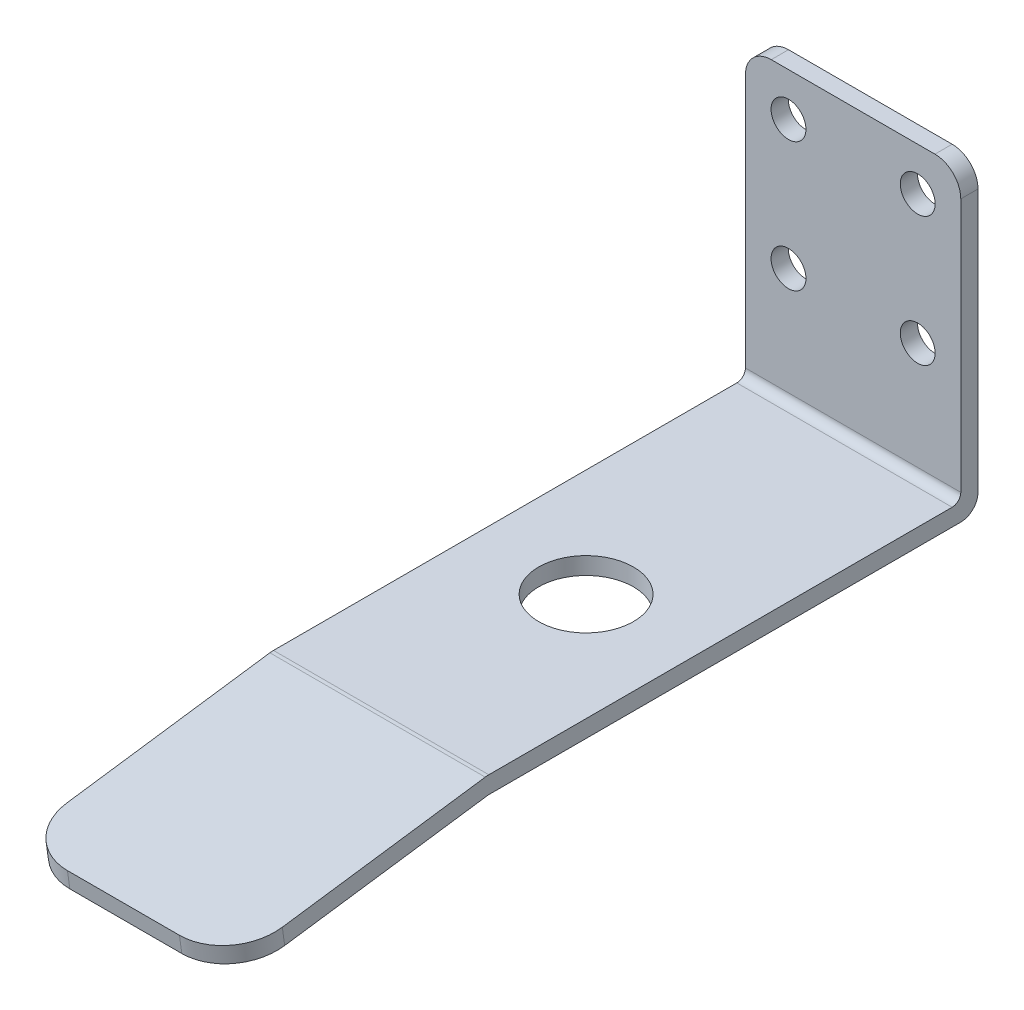
ISO-10303-21;
HEADER;
FILE_DESCRIPTION(('STEP AP214'),'2;1');
FILE_NAME('part.step','',(''),(''),'','','');
FILE_SCHEMA(('AUTOMOTIVE_DESIGN { 1 0 10303 214 1 1 1 1 }'));
ENDSEC;
DATA;
#1=APPLICATION_CONTEXT('core data for automotive mechanical design processes');
#2=APPLICATION_PROTOCOL_DEFINITION('international standard','automotive_design',2000,#1);
#3=PRODUCT_CONTEXT('',#1,'mechanical');
#4=PRODUCT('Part','Part','',(#3));
#5=PRODUCT_RELATED_PRODUCT_CATEGORY('part','',(#4));
#6=PRODUCT_DEFINITION_FORMATION('','',#4);
#7=PRODUCT_DEFINITION_CONTEXT('part definition',#1,'design');
#8=PRODUCT_DEFINITION('design','',#6,#7);
#9=PRODUCT_DEFINITION_SHAPE('','',#8);
#10=(LENGTH_UNIT() NAMED_UNIT(*) SI_UNIT(.MILLI.,.METRE.));
#11=(NAMED_UNIT(*) PLANE_ANGLE_UNIT() SI_UNIT($,.RADIAN.));
#12=(NAMED_UNIT(*) SI_UNIT($,.STERADIAN.) SOLID_ANGLE_UNIT());
#13=UNCERTAINTY_MEASURE_WITH_UNIT(LENGTH_MEASURE(1.E-05),#10,'distance_accuracy_value','');
#14=(GEOMETRIC_REPRESENTATION_CONTEXT(3) GLOBAL_UNCERTAINTY_ASSIGNED_CONTEXT((#13)) GLOBAL_UNIT_ASSIGNED_CONTEXT((#10,
#11,#12)) REPRESENTATION_CONTEXT('',''));
#15=CARTESIAN_POINT('',(0.,0.,0.));
#16=DIRECTION('',(0.,0.,1.));
#17=DIRECTION('',(1.,0.,0.));
#18=AXIS2_PLACEMENT_3D('',#15,#16,#17);
#19=CARTESIAN_POINT('',(0.,0.,2.));
#20=DIRECTION('',(0.,0.,1.));
#21=DIRECTION('',(1.,0.,0.));
#22=AXIS2_PLACEMENT_3D('',#19,#20,#21);
#23=PLANE('',#22);
#24=DIRECTION('',(0.,-1.,0.));
#25=VECTOR('',#24,1.);
#26=CARTESIAN_POINT('',(-12.5,12.5,2.));
#27=LINE('',#26,#25);
#28=CARTESIAN_POINT('',(-12.5,9.5,2.));
#29=VERTEX_POINT('',#28);
#30=CARTESIAN_POINT('',(-12.5,-20.,2.));
#31=VERTEX_POINT('',#30);
#32=EDGE_CURVE('E198',#29,#31,#27,.T.);
#33=ORIENTED_EDGE('',*,*,#32,.T.);
#34=DIRECTION('',(-1.,0.,0.));
#35=VECTOR('',#34,1.);
#36=CARTESIAN_POINT('',(0.,-20.,2.));
#37=LINE('',#36,#35);
#38=CARTESIAN_POINT('',(12.5,-20.,2.));
#39=VERTEX_POINT('',#38);
#40=EDGE_CURVE('E232',#31,#39,#37,.F.);
#41=ORIENTED_EDGE('',*,*,#40,.T.);
#42=DIRECTION('',(0.,1.,0.));
#43=VECTOR('',#42,1.);
#44=CARTESIAN_POINT('',(12.5,12.5,2.));
#45=LINE('',#44,#43);
#46=CARTESIAN_POINT('',(12.5,9.5,2.));
#47=VERTEX_POINT('',#46);
#48=EDGE_CURVE('E191',#39,#47,#45,.T.);
#49=ORIENTED_EDGE('',*,*,#48,.T.);
#50=CARTESIAN_POINT('',(9.5,9.5,2.));
#51=DIRECTION('',(0.,0.,1.));
#52=DIRECTION('',(1.,0.,0.));
#53=AXIS2_PLACEMENT_3D('',#50,#51,#52);
#54=CIRCLE('',#53,3.);
#55=CARTESIAN_POINT('',(9.5,12.5,2.));
#56=VERTEX_POINT('',#55);
#57=EDGE_CURVE('E207',#47,#56,#54,.T.);
#58=ORIENTED_EDGE('',*,*,#57,.T.);
#59=DIRECTION('',(-1.,0.,0.));
#60=VECTOR('',#59,1.);
#61=CARTESIAN_POINT('',(-12.5,12.5,2.));
#62=LINE('',#61,#60);
#63=CARTESIAN_POINT('',(-9.50000000000001,12.5,2.));
#64=VERTEX_POINT('',#63);
#65=EDGE_CURVE('E177',#56,#64,#62,.T.);
#66=ORIENTED_EDGE('',*,*,#65,.T.);
#67=CARTESIAN_POINT('',(-9.50000000000001,9.5,2.));
#68=DIRECTION('',(0.,0.,1.));
#69=DIRECTION('',(1.,0.,0.));
#70=AXIS2_PLACEMENT_3D('',#67,#68,#69);
#71=CIRCLE('',#70,3.);
#72=EDGE_CURVE('E204',#64,#29,#71,.T.);
#73=ORIENTED_EDGE('',*,*,#72,.T.);
#74=EDGE_LOOP('',(#33,#41,#49,#58,#66,#73));
#75=FACE_BOUND('',#74,.T.);
#76=CARTESIAN_POINT('',(7.50000000000016,-7.5,2.));
#77=DIRECTION('',(0.,0.,1.));
#78=DIRECTION('',(1.,0.,0.));
#79=AXIS2_PLACEMENT_3D('',#76,#77,#78);
#80=CIRCLE('',#79,2.025);
#81=CARTESIAN_POINT('',(9.52500000000015,-7.5,2.));
#82=VERTEX_POINT('',#81);
#83=EDGE_CURVE('E350',#82,#82,#80,.T.);
#84=ORIENTED_EDGE('',*,*,#83,.F.);
#85=EDGE_LOOP('',(#84));
#86=FACE_BOUND('',#85,.T.);
#87=CARTESIAN_POINT('',(-7.5,7.5,2.));
#88=DIRECTION('',(0.,0.,1.));
#89=DIRECTION('',(1.,0.,0.));
#90=AXIS2_PLACEMENT_3D('',#87,#88,#89);
#91=CIRCLE('',#90,2.025);
#92=CARTESIAN_POINT('',(-5.475,7.5,2.));
#93=VERTEX_POINT('',#92);
#94=EDGE_CURVE('E193',#93,#93,#91,.T.);
#95=ORIENTED_EDGE('',*,*,#94,.F.);
#96=EDGE_LOOP('',(#95));
#97=FACE_BOUND('',#96,.T.);
#98=CARTESIAN_POINT('',(7.5,7.5,2.));
#99=DIRECTION('',(0.,0.,1.));
#100=DIRECTION('',(1.,0.,0.));
#101=AXIS2_PLACEMENT_3D('',#98,#99,#100);
#102=CIRCLE('',#101,2.025);
#103=CARTESIAN_POINT('',(9.525,7.5,2.));
#104=VERTEX_POINT('',#103);
#105=EDGE_CURVE('E358',#104,#104,#102,.T.);
#106=ORIENTED_EDGE('',*,*,#105,.F.);
#107=EDGE_LOOP('',(#106));
#108=FACE_BOUND('',#107,.T.);
#109=CARTESIAN_POINT('',(-7.49999999999984,-7.5,2.));
#110=DIRECTION('',(0.,0.,1.));
#111=DIRECTION('',(1.,0.,0.));
#112=AXIS2_PLACEMENT_3D('',#109,#110,#111);
#113=CIRCLE('',#112,2.025);
#114=CARTESIAN_POINT('',(-5.47499999999984,-7.5,2.));
#115=VERTEX_POINT('',#114);
#116=EDGE_CURVE('E342',#115,#115,#113,.T.);
#117=ORIENTED_EDGE('',*,*,#116,.F.);
#118=EDGE_LOOP('',(#117));
#119=FACE_BOUND('',#118,.T.);
#120=ADVANCED_FACE('F38',(#75,#86,#97,#108,#119),#23,.T.);
#121=CARTESIAN_POINT('',(0.,0.,0.));
#122=DIRECTION('',(0.,0.,1.));
#123=DIRECTION('',(1.,0.,0.));
#124=AXIS2_PLACEMENT_3D('',#121,#122,#123);
#125=PLANE('',#124);
#126=DIRECTION('',(0.,1.,0.));
#127=VECTOR('',#126,1.);
#128=CARTESIAN_POINT('',(12.5,12.5,0.));
#129=LINE('',#128,#127);
#130=CARTESIAN_POINT('',(12.5,-21.,0.));
#131=VERTEX_POINT('',#130);
#132=CARTESIAN_POINT('',(12.5,9.5,0.));
#133=VERTEX_POINT('',#132);
#134=EDGE_CURVE('E186',#131,#133,#129,.T.);
#135=ORIENTED_EDGE('',*,*,#134,.F.);
#136=DIRECTION('',(1.,0.,0.));
#137=VECTOR('',#136,1.);
#138=CARTESIAN_POINT('',(-12.5,-21.,0.));
#139=LINE('',#138,#137);
#140=CARTESIAN_POINT('',(-12.5,-21.,0.));
#141=VERTEX_POINT('',#140);
#142=EDGE_CURVE('E221',#131,#141,#139,.F.);
#143=ORIENTED_EDGE('',*,*,#142,.T.);
#144=DIRECTION('',(0.,-1.,0.));
#145=VECTOR('',#144,1.);
#146=CARTESIAN_POINT('',(-12.5,12.5,0.));
#147=LINE('',#146,#145);
#148=CARTESIAN_POINT('',(-12.5,9.5,0.));
#149=VERTEX_POINT('',#148);
#150=EDGE_CURVE('E185',#149,#141,#147,.T.);
#151=ORIENTED_EDGE('',*,*,#150,.F.);
#152=CARTESIAN_POINT('',(-9.50000000000001,9.5,0.));
#153=DIRECTION('',(0.,0.,1.));
#154=DIRECTION('',(1.,0.,0.));
#155=AXIS2_PLACEMENT_3D('',#152,#153,#154);
#156=CIRCLE('',#155,3.);
#157=CARTESIAN_POINT('',(-9.50000000000001,12.5,0.));
#158=VERTEX_POINT('',#157);
#159=EDGE_CURVE('E168',#149,#158,#156,.F.);
#160=ORIENTED_EDGE('',*,*,#159,.T.);
#161=DIRECTION('',(-1.,0.,0.));
#162=VECTOR('',#161,1.);
#163=CARTESIAN_POINT('',(-12.5,12.5,0.));
#164=LINE('',#163,#162);
#165=CARTESIAN_POINT('',(9.5,12.5,0.));
#166=VERTEX_POINT('',#165);
#167=EDGE_CURVE('E174',#166,#158,#164,.T.);
#168=ORIENTED_EDGE('',*,*,#167,.F.);
#169=CARTESIAN_POINT('',(9.5,9.5,0.));
#170=DIRECTION('',(0.,0.,1.));
#171=DIRECTION('',(1.,0.,0.));
#172=AXIS2_PLACEMENT_3D('',#169,#170,#171);
#173=CIRCLE('',#172,3.);
#174=EDGE_CURVE('E157',#166,#133,#173,.F.);
#175=ORIENTED_EDGE('',*,*,#174,.T.);
#176=EDGE_LOOP('',(#135,#143,#151,#160,#168,#175));
#177=FACE_BOUND('',#176,.T.);
#178=CARTESIAN_POINT('',(-7.5,7.5,0.));
#179=DIRECTION('',(0.,0.,1.));
#180=DIRECTION('',(1.,0.,0.));
#181=AXIS2_PLACEMENT_3D('',#178,#179,#180);
#182=CIRCLE('',#181,2.025);
#183=CARTESIAN_POINT('',(-5.475,7.5,0.));
#184=VERTEX_POINT('',#183);
#185=EDGE_CURVE('E362',#184,#184,#182,.T.);
#186=ORIENTED_EDGE('',*,*,#185,.T.);
#187=EDGE_LOOP('',(#186));
#188=FACE_BOUND('',#187,.T.);
#189=CARTESIAN_POINT('',(7.5,7.5,0.));
#190=DIRECTION('',(0.,0.,1.));
#191=DIRECTION('',(1.,0.,0.));
#192=AXIS2_PLACEMENT_3D('',#189,#190,#191);
#193=CIRCLE('',#192,2.025);
#194=CARTESIAN_POINT('',(9.525,7.5,0.));
#195=VERTEX_POINT('',#194);
#196=EDGE_CURVE('E354',#195,#195,#193,.T.);
#197=ORIENTED_EDGE('',*,*,#196,.T.);
#198=EDGE_LOOP('',(#197));
#199=FACE_BOUND('',#198,.T.);
#200=CARTESIAN_POINT('',(7.50000000000016,-7.5,0.));
#201=DIRECTION('',(0.,0.,1.));
#202=DIRECTION('',(1.,0.,0.));
#203=AXIS2_PLACEMENT_3D('',#200,#201,#202);
#204=CIRCLE('',#203,2.025);
#205=CARTESIAN_POINT('',(9.52500000000015,-7.5,0.));
#206=VERTEX_POINT('',#205);
#207=EDGE_CURVE('E346',#206,#206,#204,.T.);
#208=ORIENTED_EDGE('',*,*,#207,.T.);
#209=EDGE_LOOP('',(#208));
#210=FACE_BOUND('',#209,.T.);
#211=CARTESIAN_POINT('',(-7.49999999999984,-7.5,0.));
#212=DIRECTION('',(0.,0.,1.));
#213=DIRECTION('',(1.,0.,0.));
#214=AXIS2_PLACEMENT_3D('',#211,#212,#213);
#215=CIRCLE('',#214,2.025);
#216=CARTESIAN_POINT('',(-5.47499999999984,-7.5,0.));
#217=VERTEX_POINT('',#216);
#218=EDGE_CURVE('E341',#217,#217,#215,.T.);
#219=ORIENTED_EDGE('',*,*,#218,.T.);
#220=EDGE_LOOP('',(#219));
#221=FACE_BOUND('',#220,.T.);
#222=ADVANCED_FACE('F181',(#177,#188,#199,#210,#221),#125,.F.);
#223=CARTESIAN_POINT('',(12.5,12.5,2.));
#224=DIRECTION('',(-1.,0.,0.));
#225=DIRECTION('',(0.,-1.,0.));
#226=AXIS2_PLACEMENT_3D('',#223,#224,#225);
#227=PLANE('',#226);
#228=DIRECTION('',(0.,0.139173100960066,-0.99026806874157));
#229=VECTOR('',#228,1.);
#230=CARTESIAN_POINT('',(12.5,-21.,57.));
#231=LINE('',#230,#229);
#232=CARTESIAN_POINT('',(12.5,-24.3401544230416,80.7664336497977));
#233=VERTEX_POINT('',#232);
#234=CARTESIAN_POINT('',(12.5,-21.0291957937753,57.2077388670497));
#235=VERTEX_POINT('',#234);
#236=EDGE_CURVE('E306',#233,#235,#231,.T.);
#237=ORIENTED_EDGE('',*,*,#236,.F.);
#238=DIRECTION('',(0.,0.99026806874157,0.139173100960066));
#239=VECTOR('',#238,1.);
#240=CARTESIAN_POINT('',(12.5,-26.3206905605247,80.4880874478776));
#241=LINE('',#240,#239);
#242=CARTESIAN_POINT('',(12.5,-26.3206905605248,80.4880874478775));
#243=VERTEX_POINT('',#242);
#244=EDGE_CURVE('E62',#233,#243,#241,.F.);
#245=ORIENTED_EDGE('',*,*,#244,.T.);
#246=DIRECTION('',(0.,-0.139173100960069,0.99026806874157));
#247=VECTOR('',#246,1.);
#248=CARTESIAN_POINT('',(12.5,-23.0196551450372,57.));
#249=LINE('',#248,#247);
#250=CARTESIAN_POINT('',(12.5,-23.0194638625169,56.9986389541461));
#251=VERTEX_POINT('',#250);
#252=EDGE_CURVE('E296',#251,#243,#249,.T.);
#253=ORIENTED_EDGE('',*,*,#252,.F.);
#254=CARTESIAN_POINT('',(12.5,-25.,56.7202927522259));
#255=DIRECTION('',(-1.,0.,0.));
#256=DIRECTION('',(0.,-1.,0.));
#257=AXIS2_PLACEMENT_3D('',#254,#255,#256);
#258=CIRCLE('',#257,2.);
#259=CARTESIAN_POINT('',(12.5,-23.,56.7202927522259));
#260=VERTEX_POINT('',#259);
#261=EDGE_CURVE('E263',#251,#260,#258,.T.);
#262=ORIENTED_EDGE('',*,*,#261,.T.);
#263=DIRECTION('',(0.,0.,1.));
#264=VECTOR('',#263,1.);
#265=CARTESIAN_POINT('',(12.5,-23.,0.));
#266=LINE('',#265,#264);
#267=CARTESIAN_POINT('',(12.5,-23.,2.));
#268=VERTEX_POINT('',#267);
#269=EDGE_CURVE('E337',#268,#260,#266,.T.);
#270=ORIENTED_EDGE('',*,*,#269,.F.);
#271=CARTESIAN_POINT('',(12.5,-21.,2.));
#272=DIRECTION('',(-1.,0.,0.));
#273=DIRECTION('',(0.,-1.,0.));
#274=AXIS2_PLACEMENT_3D('',#271,#272,#273);
#275=CIRCLE('',#274,2.);
#276=EDGE_CURVE('E218',#268,#131,#275,.F.);
#277=ORIENTED_EDGE('',*,*,#276,.T.);
#278=ORIENTED_EDGE('',*,*,#134,.T.);
#279=DIRECTION('',(0.,0.,-1.));
#280=VECTOR('',#279,1.);
#281=CARTESIAN_POINT('',(12.5,9.5,2.));
#282=LINE('',#281,#280);
#283=EDGE_CURVE('E163',#133,#47,#282,.F.);
#284=ORIENTED_EDGE('',*,*,#283,.T.);
#285=ORIENTED_EDGE('',*,*,#48,.F.);
#286=CARTESIAN_POINT('',(12.5,-20.,3.));
#287=DIRECTION('',(-1.,0.,0.));
#288=DIRECTION('',(0.,-1.,0.));
#289=AXIS2_PLACEMENT_3D('',#286,#287,#288);
#290=CIRCLE('',#289,1.);
#291=CARTESIAN_POINT('',(12.5,-21.,3.));
#292=VERTEX_POINT('',#291);
#293=EDGE_CURVE('E238',#39,#292,#290,.T.);
#294=ORIENTED_EDGE('',*,*,#293,.T.);
#295=DIRECTION('',(0.,0.,-1.));
#296=VECTOR('',#295,1.);
#297=CARTESIAN_POINT('',(12.5,-21.,57.));
#298=LINE('',#297,#296);
#299=CARTESIAN_POINT('',(12.5,-21.,56.7902195641695));
#300=VERTEX_POINT('',#299);
#301=EDGE_CURVE('E331',#300,#292,#298,.T.);
#302=ORIENTED_EDGE('',*,*,#301,.F.);
#303=CARTESIAN_POINT('',(12.5,-24.,56.7902195641695));
#304=DIRECTION('',(-1.,0.,0.));
#305=DIRECTION('',(0.,-1.,0.));
#306=AXIS2_PLACEMENT_3D('',#303,#304,#305);
#307=CIRCLE('',#306,3.);
#308=EDGE_CURVE('E252',#300,#235,#307,.F.);
#309=ORIENTED_EDGE('',*,*,#308,.T.);
#310=EDGE_LOOP('',(#237,#245,#253,#262,#270,#277,#278,#284,#285,#294,#302,#309));
#311=FACE_BOUND('',#310,.T.);
#312=ADVANCED_FACE('F311',(#311),#227,.F.);
#313=CARTESIAN_POINT('',(-12.5,12.5,2.));
#314=DIRECTION('',(0.,-1.,0.));
#315=DIRECTION('',(0.,0.,-1.));
#316=AXIS2_PLACEMENT_3D('',#313,#314,#315);
#317=PLANE('',#316);
#318=ORIENTED_EDGE('',*,*,#65,.F.);
#319=DIRECTION('',(0.,0.,-1.));
#320=VECTOR('',#319,1.);
#321=CARTESIAN_POINT('',(9.5,12.5,2.));
#322=LINE('',#321,#320);
#323=EDGE_CURVE('E161',#56,#166,#322,.T.);
#324=ORIENTED_EDGE('',*,*,#323,.T.);
#325=ORIENTED_EDGE('',*,*,#167,.T.);
#326=DIRECTION('',(0.,0.,-1.));
#327=VECTOR('',#326,1.);
#328=CARTESIAN_POINT('',(-9.50000000000001,12.5,2.));
#329=LINE('',#328,#327);
#330=EDGE_CURVE('E179',#158,#64,#329,.F.);
#331=ORIENTED_EDGE('',*,*,#330,.T.);
#332=EDGE_LOOP('',(#318,#324,#325,#331));
#333=FACE_BOUND('',#332,.T.);
#334=ADVANCED_FACE('F173',(#333),#317,.F.);
#335=CARTESIAN_POINT('',(-12.5,12.5,2.));
#336=DIRECTION('',(1.,0.,0.));
#337=DIRECTION('',(0.,1.,0.));
#338=AXIS2_PLACEMENT_3D('',#335,#336,#337);
#339=PLANE('',#338);
#340=DIRECTION('',(0.,-0.139173100960065,0.99026806874157));
#341=VECTOR('',#340,1.);
#342=CARTESIAN_POINT('',(-12.5,-27.1557291662851,86.429695860327));
#343=LINE('',#342,#341);
#344=CARTESIAN_POINT('',(-12.5,-23.0194638625169,56.998638954146));
#345=VERTEX_POINT('',#344);
#346=CARTESIAN_POINT('',(-12.5,-26.3206905605247,80.4880874478776));
#347=VERTEX_POINT('',#346);
#348=EDGE_CURVE('E274',#345,#347,#343,.T.);
#349=ORIENTED_EDGE('',*,*,#348,.T.);
#350=DIRECTION('',(0.,0.99026806874157,0.139173100960066));
#351=VECTOR('',#350,1.);
#352=CARTESIAN_POINT('',(-12.5,-24.3401544230416,80.7664336497977));
#353=LINE('',#352,#351);
#354=CARTESIAN_POINT('',(-12.5,-24.3401544230416,80.7664336497977));
#355=VERTEX_POINT('',#354);
#356=EDGE_CURVE('E11',#347,#355,#353,.T.);
#357=ORIENTED_EDGE('',*,*,#356,.T.);
#358=DIRECTION('',(0.,0.139173100960066,-0.99026806874157));
#359=VECTOR('',#358,1.);
#360=CARTESIAN_POINT('',(-12.5,-21.,57.));
#361=LINE('',#360,#359);
#362=CARTESIAN_POINT('',(-12.5,-21.0291957937753,57.2077388670497));
#363=VERTEX_POINT('',#362);
#364=EDGE_CURVE('E318',#355,#363,#361,.T.);
#365=ORIENTED_EDGE('',*,*,#364,.T.);
#366=CARTESIAN_POINT('',(-12.5,-24.,56.7902195641695));
#367=DIRECTION('',(1.,0.,0.));
#368=DIRECTION('',(0.,1.,0.));
#369=AXIS2_PLACEMENT_3D('',#366,#367,#368);
#370=CIRCLE('',#369,3.);
#371=CARTESIAN_POINT('',(-12.5,-21.,56.7902195641695));
#372=VERTEX_POINT('',#371);
#373=EDGE_CURVE('E246',#363,#372,#370,.F.);
#374=ORIENTED_EDGE('',*,*,#373,.T.);
#375=DIRECTION('',(0.,0.,-1.));
#376=VECTOR('',#375,1.);
#377=CARTESIAN_POINT('',(-12.5,-21.,57.));
#378=LINE('',#377,#376);
#379=CARTESIAN_POINT('',(-12.5,-21.,3.));
#380=VERTEX_POINT('',#379);
#381=EDGE_CURVE('E327',#372,#380,#378,.T.);
#382=ORIENTED_EDGE('',*,*,#381,.T.);
#383=CARTESIAN_POINT('',(-12.5,-20.,3.));
#384=DIRECTION('',(1.,0.,0.));
#385=DIRECTION('',(0.,1.,0.));
#386=AXIS2_PLACEMENT_3D('',#383,#384,#385);
#387=CIRCLE('',#386,1.);
#388=EDGE_CURVE('E235',#380,#31,#387,.T.);
#389=ORIENTED_EDGE('',*,*,#388,.T.);
#390=ORIENTED_EDGE('',*,*,#32,.F.);
#391=DIRECTION('',(0.,0.,-1.));
#392=VECTOR('',#391,1.);
#393=CARTESIAN_POINT('',(-12.5,9.5,2.));
#394=LINE('',#393,#392);
#395=EDGE_CURVE('E210',#29,#149,#394,.T.);
#396=ORIENTED_EDGE('',*,*,#395,.T.);
#397=ORIENTED_EDGE('',*,*,#150,.T.);
#398=CARTESIAN_POINT('',(-12.5,-21.,2.));
#399=DIRECTION('',(1.,0.,0.));
#400=DIRECTION('',(0.,1.,0.));
#401=AXIS2_PLACEMENT_3D('',#398,#399,#400);
#402=CIRCLE('',#401,2.);
#403=CARTESIAN_POINT('',(-12.5,-23.,2.));
#404=VERTEX_POINT('',#403);
#405=EDGE_CURVE('E224',#141,#404,#402,.F.);
#406=ORIENTED_EDGE('',*,*,#405,.T.);
#407=DIRECTION('',(0.,0.,-1.));
#408=VECTOR('',#407,1.);
#409=CARTESIAN_POINT('',(-12.5,-23.,2.));
#410=LINE('',#409,#408);
#411=CARTESIAN_POINT('',(-12.5,-23.,56.7202927522259));
#412=VERTEX_POINT('',#411);
#413=EDGE_CURVE('E334',#412,#404,#410,.T.);
#414=ORIENTED_EDGE('',*,*,#413,.F.);
#415=CARTESIAN_POINT('',(-12.5,-25.,56.7202927522259));
#416=DIRECTION('',(1.,0.,0.));
#417=DIRECTION('',(0.,1.,0.));
#418=AXIS2_PLACEMENT_3D('',#415,#416,#417);
#419=CIRCLE('',#418,2.);
#420=EDGE_CURVE('E266',#412,#345,#419,.T.);
#421=ORIENTED_EDGE('',*,*,#420,.T.);
#422=EDGE_LOOP('',(#349,#357,#365,#374,#382,#389,#390,#396,#397,#406,#414,#421));
#423=FACE_BOUND('',#422,.T.);
#424=ADVANCED_FACE('F392',(#423),#339,.F.);
#425=CARTESIAN_POINT('',(-7.5,7.5,2.));
#426=DIRECTION('',(0.,0.,-1.));
#427=DIRECTION('',(-1.,0.,0.));
#428=AXIS2_PLACEMENT_3D('',#425,#426,#427);
#429=CYLINDRICAL_SURFACE('',#428,2.025);
#430=ORIENTED_EDGE('',*,*,#94,.T.);
#431=EDGE_LOOP('',(#430));
#432=FACE_BOUND('',#431,.T.);
#433=ORIENTED_EDGE('',*,*,#185,.F.);
#434=EDGE_LOOP('',(#433));
#435=FACE_BOUND('',#434,.T.);
#436=ADVANCED_FACE('F429',(#432,#435),#429,.F.);
#437=CARTESIAN_POINT('',(7.5,7.5,2.));
#438=DIRECTION('',(0.,0.,-1.));
#439=DIRECTION('',(-1.,0.,0.));
#440=AXIS2_PLACEMENT_3D('',#437,#438,#439);
#441=CYLINDRICAL_SURFACE('',#440,2.025);
#442=ORIENTED_EDGE('',*,*,#105,.T.);
#443=EDGE_LOOP('',(#442));
#444=FACE_BOUND('',#443,.T.);
#445=ORIENTED_EDGE('',*,*,#196,.F.);
#446=EDGE_LOOP('',(#445));
#447=FACE_BOUND('',#446,.T.);
#448=ADVANCED_FACE('F604',(#444,#447),#441,.F.);
#449=CARTESIAN_POINT('',(7.50000000000016,-7.5,2.));
#450=DIRECTION('',(0.,0.,-1.));
#451=DIRECTION('',(-1.,0.,0.));
#452=AXIS2_PLACEMENT_3D('',#449,#450,#451);
#453=CYLINDRICAL_SURFACE('',#452,2.025);
#454=ORIENTED_EDGE('',*,*,#83,.T.);
#455=EDGE_LOOP('',(#454));
#456=FACE_BOUND('',#455,.T.);
#457=ORIENTED_EDGE('',*,*,#207,.F.);
#458=EDGE_LOOP('',(#457));
#459=FACE_BOUND('',#458,.T.);
#460=ADVANCED_FACE('F418',(#456,#459),#453,.F.);
#461=CARTESIAN_POINT('',(-7.49999999999984,-7.5,2.));
#462=DIRECTION('',(0.,0.,-1.));
#463=DIRECTION('',(-1.,0.,0.));
#464=AXIS2_PLACEMENT_3D('',#461,#462,#463);
#465=CYLINDRICAL_SURFACE('',#464,2.025);
#466=ORIENTED_EDGE('',*,*,#116,.T.);
#467=EDGE_LOOP('',(#466));
#468=FACE_BOUND('',#467,.T.);
#469=ORIENTED_EDGE('',*,*,#218,.F.);
#470=EDGE_LOOP('',(#469));
#471=FACE_BOUND('',#470,.T.);
#472=ADVANCED_FACE('F409',(#468,#471),#465,.F.);
#473=CARTESIAN_POINT('',(0.,-23.,0.));
#474=DIRECTION('',(0.,-1.,0.));
#475=DIRECTION('',(0.,0.,-1.));
#476=AXIS2_PLACEMENT_3D('',#473,#474,#475);
#477=PLANE('',#476);
#478=CARTESIAN_POINT('',(0.,-23.,33.));
#479=DIRECTION('',(0.,-1.,0.));
#480=DIRECTION('',(0.,0.,-1.));
#481=AXIS2_PLACEMENT_3D('',#478,#479,#480);
#482=CIRCLE('',#481,5.5);
#483=CARTESIAN_POINT('',(0.,-23.,27.5));
#484=VERTEX_POINT('',#483);
#485=EDGE_CURVE('E275',#484,#484,#482,.T.);
#486=ORIENTED_EDGE('',*,*,#485,.F.);
#487=EDGE_LOOP('',(#486));
#488=FACE_BOUND('',#487,.T.);
#489=ORIENTED_EDGE('',*,*,#269,.T.);
#490=DIRECTION('',(1.,0.,0.));
#491=VECTOR('',#490,1.);
#492=CARTESIAN_POINT('',(-12.5,-23.,56.7202927522259));
#493=LINE('',#492,#491);
#494=EDGE_CURVE('E260',#260,#412,#493,.F.);
#495=ORIENTED_EDGE('',*,*,#494,.T.);
#496=ORIENTED_EDGE('',*,*,#413,.T.);
#497=DIRECTION('',(1.,0.,0.));
#498=VECTOR('',#497,1.);
#499=CARTESIAN_POINT('',(12.5,-23.,2.));
#500=LINE('',#499,#498);
#501=EDGE_CURVE('E214',#404,#268,#500,.T.);
#502=ORIENTED_EDGE('',*,*,#501,.T.);
#503=EDGE_LOOP('',(#489,#495,#496,#502));
#504=FACE_BOUND('',#503,.T.);
#505=ADVANCED_FACE('F406',(#488,#504),#477,.T.);
#506=CARTESIAN_POINT('',(12.5,-21.,57.));
#507=DIRECTION('',(0.,-1.,0.));
#508=DIRECTION('',(0.,0.,-1.));
#509=AXIS2_PLACEMENT_3D('',#506,#507,#508);
#510=PLANE('',#509);
#511=CARTESIAN_POINT('',(0.,-21.,33.));
#512=DIRECTION('',(0.,-1.,0.));
#513=DIRECTION('',(0.,0.,-1.));
#514=AXIS2_PLACEMENT_3D('',#511,#512,#513);
#515=CIRCLE('',#514,5.5);
#516=CARTESIAN_POINT('',(0.,-21.,27.5));
#517=VERTEX_POINT('',#516);
#518=EDGE_CURVE('E270',#517,#517,#515,.T.);
#519=ORIENTED_EDGE('',*,*,#518,.T.);
#520=EDGE_LOOP('',(#519));
#521=FACE_BOUND('',#520,.T.);
#522=ORIENTED_EDGE('',*,*,#381,.F.);
#523=DIRECTION('',(-1.,0.,0.));
#524=VECTOR('',#523,1.);
#525=CARTESIAN_POINT('',(12.5,-21.,56.7902195641695));
#526=LINE('',#525,#524);
#527=EDGE_CURVE('E249',#372,#300,#526,.F.);
#528=ORIENTED_EDGE('',*,*,#527,.T.);
#529=ORIENTED_EDGE('',*,*,#301,.T.);
#530=DIRECTION('',(-1.,0.,0.));
#531=VECTOR('',#530,1.);
#532=CARTESIAN_POINT('',(12.5,-21.,3.));
#533=LINE('',#532,#531);
#534=EDGE_CURVE('E228',#292,#380,#533,.T.);
#535=ORIENTED_EDGE('',*,*,#534,.T.);
#536=EDGE_LOOP('',(#522,#528,#529,#535));
#537=FACE_BOUND('',#536,.T.);
#538=ADVANCED_FACE('F408',(#521,#537),#510,.F.);
#539=CARTESIAN_POINT('',(9.5,9.5,2.));
#540=DIRECTION('',(0.,0.,-1.));
#541=DIRECTION('',(-1.,0.,0.));
#542=AXIS2_PLACEMENT_3D('',#539,#540,#541);
#543=CYLINDRICAL_SURFACE('',#542,3.);
#544=ORIENTED_EDGE('',*,*,#57,.F.);
#545=ORIENTED_EDGE('',*,*,#283,.F.);
#546=ORIENTED_EDGE('',*,*,#174,.F.);
#547=ORIENTED_EDGE('',*,*,#323,.F.);
#548=EDGE_LOOP('',(#544,#545,#546,#547));
#549=FACE_BOUND('',#548,.T.);
#550=ADVANCED_FACE('F160',(#549),#543,.T.);
#551=CARTESIAN_POINT('',(-9.50000000000001,9.5,2.));
#552=DIRECTION('',(0.,0.,-1.));
#553=DIRECTION('',(-1.,0.,0.));
#554=AXIS2_PLACEMENT_3D('',#551,#552,#553);
#555=CYLINDRICAL_SURFACE('',#554,3.);
#556=ORIENTED_EDGE('',*,*,#72,.F.);
#557=ORIENTED_EDGE('',*,*,#330,.F.);
#558=ORIENTED_EDGE('',*,*,#159,.F.);
#559=ORIENTED_EDGE('',*,*,#395,.F.);
#560=EDGE_LOOP('',(#556,#557,#558,#559));
#561=FACE_BOUND('',#560,.T.);
#562=ADVANCED_FACE('F391',(#561),#555,.T.);
#563=CARTESIAN_POINT('',(0.,-21.,2.));
#564=DIRECTION('',(-1.,0.,0.));
#565=DIRECTION('',(0.,0.,1.));
#566=AXIS2_PLACEMENT_3D('',#563,#564,#565);
#567=CYLINDRICAL_SURFACE('',#566,2.);
#568=ORIENTED_EDGE('',*,*,#405,.F.);
#569=ORIENTED_EDGE('',*,*,#142,.F.);
#570=ORIENTED_EDGE('',*,*,#276,.F.);
#571=ORIENTED_EDGE('',*,*,#501,.F.);
#572=EDGE_LOOP('',(#568,#569,#570,#571));
#573=FACE_BOUND('',#572,.T.);
#574=ADVANCED_FACE('F396',(#573),#567,.T.);
#575=CARTESIAN_POINT('',(12.5,-20.,3.));
#576=DIRECTION('',(-1.,0.,0.));
#577=DIRECTION('',(0.,0.,1.));
#578=AXIS2_PLACEMENT_3D('',#575,#576,#577);
#579=CYLINDRICAL_SURFACE('',#578,1.);
#580=ORIENTED_EDGE('',*,*,#293,.F.);
#581=ORIENTED_EDGE('',*,*,#40,.F.);
#582=ORIENTED_EDGE('',*,*,#388,.F.);
#583=ORIENTED_EDGE('',*,*,#534,.F.);
#584=EDGE_LOOP('',(#580,#581,#582,#583));
#585=FACE_BOUND('',#584,.T.);
#586=ADVANCED_FACE('F388',(#585),#579,.F.);
#587=CARTESIAN_POINT('',(12.5,-21.,57.));
#588=DIRECTION('',(0.,0.99026806874157,0.139173100960066));
#589=DIRECTION('',(0.,-0.139173100960066,0.99026806874157));
#590=AXIS2_PLACEMENT_3D('',#587,#588,#589);
#591=PLANE('',#590);
#592=DIRECTION('',(-1.,0.,0.));
#593=VECTOR('',#592,1.);
#594=CARTESIAN_POINT('',(12.5,-25.175193028802,86.7080420622471));
#595=LINE('',#594,#593);
#596=CARTESIAN_POINT('',(6.5,-25.175193028802,86.7080420622471));
#597=VERTEX_POINT('',#596);
#598=CARTESIAN_POINT('',(-6.5,-25.175193028802,86.7080420622471));
#599=VERTEX_POINT('',#598);
#600=EDGE_CURVE('E305',#597,#599,#595,.T.);
#601=ORIENTED_EDGE('',*,*,#600,.F.);
#602=CARTESIAN_POINT('',(6.5,-24.3401544230416,80.7664336497977));
#603=DIRECTION('',(0.,0.99026806874157,0.139173100960066));
#604=DIRECTION('',(0.,-0.139173100960066,0.99026806874157));
#605=AXIS2_PLACEMENT_3D('',#602,#603,#604);
#606=CIRCLE('',#605,6.);
#607=EDGE_CURVE('E285',#597,#233,#606,.T.);
#608=ORIENTED_EDGE('',*,*,#607,.T.);
#609=ORIENTED_EDGE('',*,*,#236,.T.);
#610=DIRECTION('',(-1.,0.,0.));
#611=VECTOR('',#610,1.);
#612=CARTESIAN_POINT('',(-12.5,-21.0291957937753,57.2077388670497));
#613=LINE('',#612,#611);
#614=EDGE_CURVE('E242',#235,#363,#613,.T.);
#615=ORIENTED_EDGE('',*,*,#614,.T.);
#616=ORIENTED_EDGE('',*,*,#364,.F.);
#617=CARTESIAN_POINT('',(-6.5,-24.3401544230416,80.7664336497977));
#618=DIRECTION('',(0.,0.99026806874157,0.139173100960066));
#619=DIRECTION('',(0.,-0.139173100960066,0.99026806874157));
#620=AXIS2_PLACEMENT_3D('',#617,#618,#619);
#621=CIRCLE('',#620,6.);
#622=EDGE_CURVE('E282',#355,#599,#621,.T.);
#623=ORIENTED_EDGE('',*,*,#622,.T.);
#624=EDGE_LOOP('',(#601,#608,#609,#615,#616,#623));
#625=FACE_BOUND('',#624,.T.);
#626=ADVANCED_FACE('F310',(#625),#591,.T.);
#627=CARTESIAN_POINT('',(12.5,-25.175193028802,86.7080420622471));
#628=DIRECTION('',(0.,-0.139173100960066,0.99026806874157));
#629=DIRECTION('',(0.,-0.99026806874157,-0.139173100960066));
#630=AXIS2_PLACEMENT_3D('',#627,#628,#629);
#631=PLANE('',#630);
#632=DIRECTION('',(-1.,0.,0.));
#633=VECTOR('',#632,1.);
#634=CARTESIAN_POINT('',(12.5,-27.1557291662851,86.429695860327));
#635=LINE('',#634,#633);
#636=CARTESIAN_POINT('',(6.5,-27.1557291662851,86.429695860327));
#637=VERTEX_POINT('',#636);
#638=CARTESIAN_POINT('',(-6.5,-27.1557291662851,86.429695860327));
#639=VERTEX_POINT('',#638);
#640=EDGE_CURVE('E295',#637,#639,#635,.T.);
#641=ORIENTED_EDGE('',*,*,#640,.F.);
#642=DIRECTION('',(0.,0.99026806874157,0.139173100960066));
#643=VECTOR('',#642,1.);
#644=CARTESIAN_POINT('',(6.5,-25.175193028802,86.7080420622471));
#645=LINE('',#644,#643);
#646=EDGE_CURVE('E278',#637,#597,#645,.T.);
#647=ORIENTED_EDGE('',*,*,#646,.T.);
#648=ORIENTED_EDGE('',*,*,#600,.T.);
#649=DIRECTION('',(0.,0.99026806874157,0.139173100960066));
#650=VECTOR('',#649,1.);
#651=CARTESIAN_POINT('',(-6.5,-27.1557291662851,86.429695860327));
#652=LINE('',#651,#650);
#653=EDGE_CURVE('E269',#599,#639,#652,.F.);
#654=ORIENTED_EDGE('',*,*,#653,.T.);
#655=EDGE_LOOP('',(#641,#647,#648,#654));
#656=FACE_BOUND('',#655,.T.);
#657=ADVANCED_FACE('F300',(#656),#631,.T.);
#658=CARTESIAN_POINT('',(12.5,-27.1557291662851,86.429695860327));
#659=DIRECTION('',(0.,-0.99026806874157,-0.139173100960065));
#660=DIRECTION('',(0.,0.139173100960065,-0.99026806874157));
#661=AXIS2_PLACEMENT_3D('',#658,#659,#660);
#662=PLANE('',#661);
#663=ORIENTED_EDGE('',*,*,#252,.T.);
#664=CARTESIAN_POINT('',(6.5,-26.3206905605247,80.4880874478776));
#665=DIRECTION('',(0.,-0.99026806874157,-0.139173100960065));
#666=DIRECTION('',(0.,0.139173100960065,-0.99026806874157));
#667=AXIS2_PLACEMENT_3D('',#664,#665,#666);
#668=CIRCLE('',#667,6.);
#669=EDGE_CURVE('E47',#243,#637,#668,.T.);
#670=ORIENTED_EDGE('',*,*,#669,.T.);
#671=ORIENTED_EDGE('',*,*,#640,.T.);
#672=CARTESIAN_POINT('',(-6.5,-26.3206905605247,80.4880874478776));
#673=DIRECTION('',(0.,-0.99026806874157,-0.139173100960065));
#674=DIRECTION('',(0.,0.139173100960065,-0.99026806874157));
#675=AXIS2_PLACEMENT_3D('',#672,#673,#674);
#676=CIRCLE('',#675,6.);
#677=EDGE_CURVE('E54',#639,#347,#676,.T.);
#678=ORIENTED_EDGE('',*,*,#677,.T.);
#679=ORIENTED_EDGE('',*,*,#348,.F.);
#680=DIRECTION('',(1.,0.,0.));
#681=VECTOR('',#680,1.);
#682=CARTESIAN_POINT('',(12.5,-23.0194638625169,56.9986389541461));
#683=LINE('',#682,#681);
#684=EDGE_CURVE('E256',#345,#251,#683,.T.);
#685=ORIENTED_EDGE('',*,*,#684,.T.);
#686=EDGE_LOOP('',(#663,#670,#671,#678,#679,#685));
#687=FACE_BOUND('',#686,.T.);
#688=ADVANCED_FACE('F294',(#687),#662,.T.);
#689=CARTESIAN_POINT('',(12.5,-24.,56.7902195641695));
#690=DIRECTION('',(1.,0.,0.));
#691=DIRECTION('',(0.,0.,-1.));
#692=AXIS2_PLACEMENT_3D('',#689,#690,#691);
#693=CYLINDRICAL_SURFACE('',#692,3.);
#694=ORIENTED_EDGE('',*,*,#308,.F.);
#695=ORIENTED_EDGE('',*,*,#527,.F.);
#696=ORIENTED_EDGE('',*,*,#373,.F.);
#697=ORIENTED_EDGE('',*,*,#614,.F.);
#698=EDGE_LOOP('',(#694,#695,#696,#697));
#699=FACE_BOUND('',#698,.T.);
#700=ADVANCED_FACE('F446',(#699),#693,.T.);
#701=CARTESIAN_POINT('',(12.5,-25.,56.7202927522259));
#702=DIRECTION('',(-1.,0.,0.));
#703=DIRECTION('',(0.,0.,1.));
#704=AXIS2_PLACEMENT_3D('',#701,#702,#703);
#705=CYLINDRICAL_SURFACE('',#704,2.);
#706=ORIENTED_EDGE('',*,*,#420,.F.);
#707=ORIENTED_EDGE('',*,*,#494,.F.);
#708=ORIENTED_EDGE('',*,*,#261,.F.);
#709=ORIENTED_EDGE('',*,*,#684,.F.);
#710=EDGE_LOOP('',(#706,#707,#708,#709));
#711=FACE_BOUND('',#710,.T.);
#712=ADVANCED_FACE('F404',(#711),#705,.F.);
#713=CARTESIAN_POINT('',(0.,12.5,33.));
#714=DIRECTION('',(0.,-1.,0.));
#715=DIRECTION('',(0.,0.,-1.));
#716=AXIS2_PLACEMENT_3D('',#713,#714,#715);
#717=CYLINDRICAL_SURFACE('',#716,5.5);
#718=ORIENTED_EDGE('',*,*,#485,.T.);
#719=EDGE_LOOP('',(#718));
#720=FACE_BOUND('',#719,.T.);
#721=ORIENTED_EDGE('',*,*,#518,.F.);
#722=EDGE_LOOP('',(#721));
#723=FACE_BOUND('',#722,.T.);
#724=ADVANCED_FACE('F451',(#720,#723),#717,.F.);
#725=CARTESIAN_POINT('',(6.5,-24.3401544230416,80.7664336497977));
#726=DIRECTION('',(0.,-0.99026806874157,-0.139173100960066));
#727=DIRECTION('',(0.,0.139173100960066,-0.99026806874157));
#728=AXIS2_PLACEMENT_3D('',#725,#726,#727);
#729=CYLINDRICAL_SURFACE('',#728,6.);
#730=ORIENTED_EDGE('',*,*,#669,.F.);
#731=ORIENTED_EDGE('',*,*,#244,.F.);
#732=ORIENTED_EDGE('',*,*,#607,.F.);
#733=ORIENTED_EDGE('',*,*,#646,.F.);
#734=EDGE_LOOP('',(#730,#731,#732,#733));
#735=FACE_BOUND('',#734,.T.);
#736=ADVANCED_FACE('F308',(#735),#729,.T.);
#737=CARTESIAN_POINT('',(-6.5,0.930951698957723,84.3180559980362));
#738=DIRECTION('',(0.,-0.99026806874157,-0.139173100960066));
#739=DIRECTION('',(0.,0.139173100960066,-0.99026806874157));
#740=AXIS2_PLACEMENT_3D('',#737,#738,#739);
#741=CYLINDRICAL_SURFACE('',#740,6.);
#742=ORIENTED_EDGE('',*,*,#677,.F.);
#743=ORIENTED_EDGE('',*,*,#653,.F.);
#744=ORIENTED_EDGE('',*,*,#622,.F.);
#745=ORIENTED_EDGE('',*,*,#356,.F.);
#746=EDGE_LOOP('',(#742,#743,#744,#745));
#747=FACE_BOUND('',#746,.T.);
#748=ADVANCED_FACE('F40',(#747),#741,.T.);
#749=CLOSED_SHELL('',(#120,#222,#312,#334,#424,#436,#448,#460,#472,#505,#538,#550,#562,#574,
#586,#626,#657,#688,#700,#712,#724,#736,#748));
#750=MANIFOLD_SOLID_BREP('B2',#749);
#751=ADVANCED_BREP_SHAPE_REPRESENTATION('',(#18,#750),#14);
#752=SHAPE_DEFINITION_REPRESENTATION(#9,#751);
ENDSEC;
END-ISO-10303-21;
